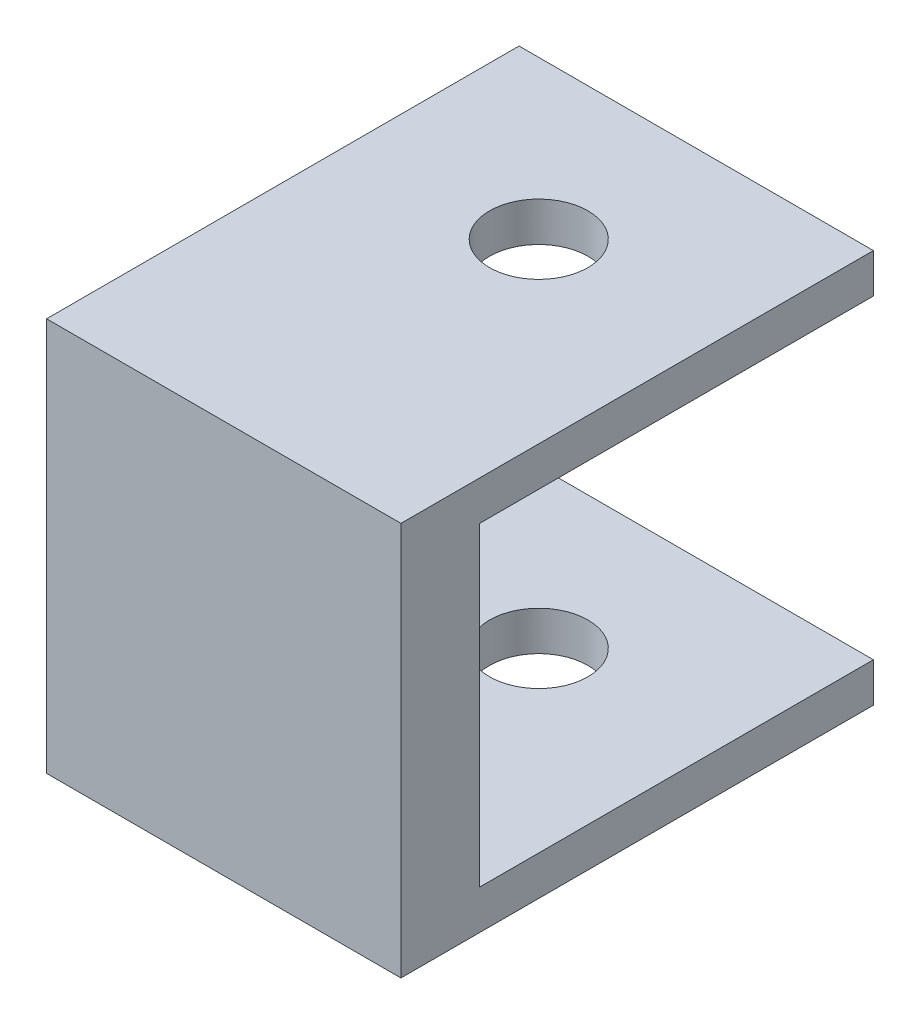
ISO-10303-21;
HEADER;
FILE_DESCRIPTION(('STEP AP214'),'2;1');
FILE_NAME('part.step','',(''),(''),'','','');
FILE_SCHEMA(('AUTOMOTIVE_DESIGN { 1 0 10303 214 1 1 1 1 }'));
ENDSEC;
DATA;
#1=APPLICATION_CONTEXT('core data for automotive mechanical design processes');
#2=APPLICATION_PROTOCOL_DEFINITION('international standard','automotive_design',2000,#1);
#3=PRODUCT_CONTEXT('',#1,'mechanical');
#4=PRODUCT('Part','Part','',(#3));
#5=PRODUCT_RELATED_PRODUCT_CATEGORY('part','',(#4));
#6=PRODUCT_DEFINITION_FORMATION('','',#4);
#7=PRODUCT_DEFINITION_CONTEXT('part definition',#1,'design');
#8=PRODUCT_DEFINITION('design','',#6,#7);
#9=PRODUCT_DEFINITION_SHAPE('','',#8);
#10=(LENGTH_UNIT() NAMED_UNIT(*) SI_UNIT(.MILLI.,.METRE.));
#11=(NAMED_UNIT(*) PLANE_ANGLE_UNIT() SI_UNIT($,.RADIAN.));
#12=(NAMED_UNIT(*) SI_UNIT($,.STERADIAN.) SOLID_ANGLE_UNIT());
#13=UNCERTAINTY_MEASURE_WITH_UNIT(LENGTH_MEASURE(1.E-05),#10,'distance_accuracy_value','');
#14=(GEOMETRIC_REPRESENTATION_CONTEXT(3) GLOBAL_UNCERTAINTY_ASSIGNED_CONTEXT((#13)) GLOBAL_UNIT_ASSIGNED_CONTEXT((#10,
#11,#12)) REPRESENTATION_CONTEXT('',''));
#15=CARTESIAN_POINT('',(0.,0.,0.));
#16=DIRECTION('',(0.,0.,1.));
#17=DIRECTION('',(1.,0.,0.));
#18=AXIS2_PLACEMENT_3D('',#15,#16,#17);
#19=CARTESIAN_POINT('',(18.,20.,-24.));
#20=DIRECTION('',(0.,-1.,0.));
#21=DIRECTION('',(0.,0.,-1.));
#22=AXIS2_PLACEMENT_3D('',#19,#20,#21);
#23=PLANE('',#22);
#24=CARTESIAN_POINT('',(9.,20.,-16.));
#25=DIRECTION('',(0.,-1.,0.));
#26=DIRECTION('',(0.,0.,-1.));
#27=AXIS2_PLACEMENT_3D('',#24,#25,#26);
#28=CIRCLE('',#27,2.5);
#29=CARTESIAN_POINT('',(9.,20.,-18.5));
#30=VERTEX_POINT('',#29);
#31=EDGE_CURVE('E138',#30,#30,#28,.F.);
#32=ORIENTED_EDGE('',*,*,#31,.F.);
#33=EDGE_LOOP('',(#32));
#34=FACE_BOUND('',#33,.T.);
#35=DIRECTION('',(0.,0.,1.));
#36=VECTOR('',#35,1.);
#37=CARTESIAN_POINT('',(0.,20.,-24.));
#38=LINE('',#37,#36);
#39=CARTESIAN_POINT('',(0.,20.,-24.));
#40=VERTEX_POINT('',#39);
#41=CARTESIAN_POINT('',(0.,20.,0.));
#42=VERTEX_POINT('',#41);
#43=EDGE_CURVE('E134',#40,#42,#38,.T.);
#44=ORIENTED_EDGE('',*,*,#43,.T.);
#45=DIRECTION('',(-1.,0.,0.));
#46=VECTOR('',#45,1.);
#47=CARTESIAN_POINT('',(18.,20.,0.));
#48=LINE('',#47,#46);
#49=CARTESIAN_POINT('',(18.,20.,0.));
#50=VERTEX_POINT('',#49);
#51=EDGE_CURVE('E11',#50,#42,#48,.T.);
#52=ORIENTED_EDGE('',*,*,#51,.F.);
#53=DIRECTION('',(0.,0.,1.));
#54=VECTOR('',#53,1.);
#55=CARTESIAN_POINT('',(18.,20.,-24.));
#56=LINE('',#55,#54);
#57=CARTESIAN_POINT('',(18.,20.,-24.));
#58=VERTEX_POINT('',#57);
#59=EDGE_CURVE('E149',#58,#50,#56,.T.);
#60=ORIENTED_EDGE('',*,*,#59,.F.);
#61=DIRECTION('',(-1.,0.,0.));
#62=VECTOR('',#61,1.);
#63=CARTESIAN_POINT('',(18.,20.,-24.));
#64=LINE('',#63,#62);
#65=EDGE_CURVE('E130',#58,#40,#64,.T.);
#66=ORIENTED_EDGE('',*,*,#65,.T.);
#67=EDGE_LOOP('',(#44,#52,#60,#66));
#68=FACE_BOUND('',#67,.T.);
#69=ADVANCED_FACE('F37',(#34,#68),#23,.F.);
#70=CARTESIAN_POINT('',(18.,20.,0.));
#71=DIRECTION('',(0.,0.,-1.));
#72=DIRECTION('',(-1.,0.,0.));
#73=AXIS2_PLACEMENT_3D('',#70,#71,#72);
#74=PLANE('',#73);
#75=DIRECTION('',(0.,-1.,0.));
#76=VECTOR('',#75,1.);
#77=CARTESIAN_POINT('',(0.,20.,0.));
#78=LINE('',#77,#76);
#79=CARTESIAN_POINT('',(0.,0.,0.));
#80=VERTEX_POINT('',#79);
#81=EDGE_CURVE('E137',#42,#80,#78,.T.);
#82=ORIENTED_EDGE('',*,*,#81,.T.);
#83=DIRECTION('',(-1.,0.,0.));
#84=VECTOR('',#83,1.);
#85=CARTESIAN_POINT('',(18.,0.,0.));
#86=LINE('',#85,#84);
#87=CARTESIAN_POINT('',(18.,0.,0.));
#88=VERTEX_POINT('',#87);
#89=EDGE_CURVE('E46',#88,#80,#86,.T.);
#90=ORIENTED_EDGE('',*,*,#89,.F.);
#91=DIRECTION('',(0.,-1.,0.));
#92=VECTOR('',#91,1.);
#93=CARTESIAN_POINT('',(18.,20.,0.));
#94=LINE('',#93,#92);
#95=EDGE_CURVE('E97',#50,#88,#94,.T.);
#96=ORIENTED_EDGE('',*,*,#95,.F.);
#97=ORIENTED_EDGE('',*,*,#51,.T.);
#98=EDGE_LOOP('',(#82,#90,#96,#97));
#99=FACE_BOUND('',#98,.T.);
#100=ADVANCED_FACE('F208',(#99),#74,.F.);
#101=CARTESIAN_POINT('',(18.,0.,0.));
#102=DIRECTION('',(0.,1.,0.));
#103=DIRECTION('',(0.,0.,1.));
#104=AXIS2_PLACEMENT_3D('',#101,#102,#103);
#105=PLANE('',#104);
#106=CARTESIAN_POINT('',(9.,0.,-16.));
#107=DIRECTION('',(0.,1.,0.));
#108=DIRECTION('',(0.,0.,1.));
#109=AXIS2_PLACEMENT_3D('',#106,#107,#108);
#110=CIRCLE('',#109,2.5);
#111=CARTESIAN_POINT('',(9.,0.,-13.5));
#112=VERTEX_POINT('',#111);
#113=EDGE_CURVE('E185',#112,#112,#110,.F.);
#114=ORIENTED_EDGE('',*,*,#113,.F.);
#115=EDGE_LOOP('',(#114));
#116=FACE_BOUND('',#115,.T.);
#117=DIRECTION('',(0.,0.,-1.));
#118=VECTOR('',#117,1.);
#119=CARTESIAN_POINT('',(0.,0.,0.));
#120=LINE('',#119,#118);
#121=CARTESIAN_POINT('',(0.,0.,-24.));
#122=VERTEX_POINT('',#121);
#123=EDGE_CURVE('E140',#80,#122,#120,.T.);
#124=ORIENTED_EDGE('',*,*,#123,.T.);
#125=DIRECTION('',(-1.,0.,0.));
#126=VECTOR('',#125,1.);
#127=CARTESIAN_POINT('',(18.,0.,-24.));
#128=LINE('',#127,#126);
#129=CARTESIAN_POINT('',(18.,0.,-24.));
#130=VERTEX_POINT('',#129);
#131=EDGE_CURVE('E156',#130,#122,#128,.T.);
#132=ORIENTED_EDGE('',*,*,#131,.F.);
#133=DIRECTION('',(0.,0.,-1.));
#134=VECTOR('',#133,1.);
#135=CARTESIAN_POINT('',(18.,0.,0.));
#136=LINE('',#135,#134);
#137=EDGE_CURVE('E165',#88,#130,#136,.T.);
#138=ORIENTED_EDGE('',*,*,#137,.F.);
#139=ORIENTED_EDGE('',*,*,#89,.T.);
#140=EDGE_LOOP('',(#124,#132,#138,#139));
#141=FACE_BOUND('',#140,.T.);
#142=ADVANCED_FACE('F163',(#116,#141),#105,.F.);
#143=CARTESIAN_POINT('',(18.,0.,-24.));
#144=DIRECTION('',(0.,0.,1.));
#145=DIRECTION('',(1.,0.,0.));
#146=AXIS2_PLACEMENT_3D('',#143,#144,#145);
#147=PLANE('',#146);
#148=DIRECTION('',(0.,1.,0.));
#149=VECTOR('',#148,1.);
#150=CARTESIAN_POINT('',(0.,0.,-24.));
#151=LINE('',#150,#149);
#152=CARTESIAN_POINT('',(0.,2.00000000000001,-24.));
#153=VERTEX_POINT('',#152);
#154=EDGE_CURVE('E142',#122,#153,#151,.T.);
#155=ORIENTED_EDGE('',*,*,#154,.T.);
#156=DIRECTION('',(-1.,0.,0.));
#157=VECTOR('',#156,1.);
#158=CARTESIAN_POINT('',(18.,2.00000000000001,-24.));
#159=LINE('',#158,#157);
#160=CARTESIAN_POINT('',(18.,2.00000000000001,-24.));
#161=VERTEX_POINT('',#160);
#162=EDGE_CURVE('E153',#161,#153,#159,.T.);
#163=ORIENTED_EDGE('',*,*,#162,.F.);
#164=DIRECTION('',(0.,1.,0.));
#165=VECTOR('',#164,1.);
#166=CARTESIAN_POINT('',(18.,0.,-24.));
#167=LINE('',#166,#165);
#168=EDGE_CURVE('E177',#130,#161,#167,.T.);
#169=ORIENTED_EDGE('',*,*,#168,.F.);
#170=ORIENTED_EDGE('',*,*,#131,.T.);
#171=EDGE_LOOP('',(#155,#163,#169,#170));
#172=FACE_BOUND('',#171,.T.);
#173=ADVANCED_FACE('F173',(#172),#147,.F.);
#174=CARTESIAN_POINT('',(18.,2.00000000000001,-24.));
#175=DIRECTION('',(0.,-1.,0.));
#176=DIRECTION('',(0.,0.,-1.));
#177=AXIS2_PLACEMENT_3D('',#174,#175,#176);
#178=PLANE('',#177);
#179=CARTESIAN_POINT('',(9.,2.,-16.));
#180=DIRECTION('',(0.,-1.,0.));
#181=DIRECTION('',(0.,0.,-1.));
#182=AXIS2_PLACEMENT_3D('',#179,#180,#181);
#183=CIRCLE('',#182,2.5);
#184=CARTESIAN_POINT('',(9.,2.,-18.5));
#185=VERTEX_POINT('',#184);
#186=EDGE_CURVE('E188',#185,#185,#183,.F.);
#187=ORIENTED_EDGE('',*,*,#186,.F.);
#188=EDGE_LOOP('',(#187));
#189=FACE_BOUND('',#188,.T.);
#190=DIRECTION('',(0.,0.,1.));
#191=VECTOR('',#190,1.);
#192=CARTESIAN_POINT('',(0.,2.00000000000001,-24.));
#193=LINE('',#192,#191);
#194=CARTESIAN_POINT('',(0.,2.,-4.));
#195=VERTEX_POINT('',#194);
#196=EDGE_CURVE('E144',#153,#195,#193,.T.);
#197=ORIENTED_EDGE('',*,*,#196,.T.);
#198=DIRECTION('',(-1.,0.,0.));
#199=VECTOR('',#198,1.);
#200=CARTESIAN_POINT('',(18.,2.,-4.));
#201=LINE('',#200,#199);
#202=CARTESIAN_POINT('',(18.,2.,-4.));
#203=VERTEX_POINT('',#202);
#204=EDGE_CURVE('E125',#203,#195,#201,.T.);
#205=ORIENTED_EDGE('',*,*,#204,.F.);
#206=DIRECTION('',(0.,0.,1.));
#207=VECTOR('',#206,1.);
#208=CARTESIAN_POINT('',(18.,2.00000000000001,-24.));
#209=LINE('',#208,#207);
#210=EDGE_CURVE('E116',#161,#203,#209,.T.);
#211=ORIENTED_EDGE('',*,*,#210,.F.);
#212=ORIENTED_EDGE('',*,*,#162,.T.);
#213=EDGE_LOOP('',(#197,#205,#211,#212));
#214=FACE_BOUND('',#213,.T.);
#215=ADVANCED_FACE('F176',(#189,#214),#178,.F.);
#216=CARTESIAN_POINT('',(18.,2.,-4.));
#217=DIRECTION('',(0.,0.,1.));
#218=DIRECTION('',(0.,-1.,0.));
#219=AXIS2_PLACEMENT_3D('',#216,#217,#218);
#220=PLANE('',#219);
#221=DIRECTION('',(0.,1.,0.));
#222=VECTOR('',#221,1.);
#223=CARTESIAN_POINT('',(0.,2.,-4.));
#224=LINE('',#223,#222);
#225=CARTESIAN_POINT('',(0.,18.,-4.));
#226=VERTEX_POINT('',#225);
#227=EDGE_CURVE('E124',#195,#226,#224,.T.);
#228=ORIENTED_EDGE('',*,*,#227,.T.);
#229=DIRECTION('',(-1.,0.,0.));
#230=VECTOR('',#229,1.);
#231=CARTESIAN_POINT('',(18.,18.,-4.));
#232=LINE('',#231,#230);
#233=CARTESIAN_POINT('',(18.,18.,-4.));
#234=VERTEX_POINT('',#233);
#235=EDGE_CURVE('E121',#234,#226,#232,.T.);
#236=ORIENTED_EDGE('',*,*,#235,.F.);
#237=DIRECTION('',(0.,1.,0.));
#238=VECTOR('',#237,1.);
#239=CARTESIAN_POINT('',(18.,2.,-4.));
#240=LINE('',#239,#238);
#241=EDGE_CURVE('E110',#203,#234,#240,.T.);
#242=ORIENTED_EDGE('',*,*,#241,.F.);
#243=ORIENTED_EDGE('',*,*,#204,.T.);
#244=EDGE_LOOP('',(#228,#236,#242,#243));
#245=FACE_BOUND('',#244,.T.);
#246=ADVANCED_FACE('F122',(#245),#220,.F.);
#247=CARTESIAN_POINT('',(18.,18.,-4.));
#248=DIRECTION('',(0.,1.,0.));
#249=DIRECTION('',(0.,0.,1.));
#250=AXIS2_PLACEMENT_3D('',#247,#248,#249);
#251=PLANE('',#250);
#252=CARTESIAN_POINT('',(9.,18.,-16.));
#253=DIRECTION('',(0.,1.,0.));
#254=DIRECTION('',(0.,0.,1.));
#255=AXIS2_PLACEMENT_3D('',#252,#253,#254);
#256=CIRCLE('',#255,2.5);
#257=CARTESIAN_POINT('',(9.,18.,-13.5));
#258=VERTEX_POINT('',#257);
#259=EDGE_CURVE('E40',#258,#258,#256,.F.);
#260=ORIENTED_EDGE('',*,*,#259,.F.);
#261=EDGE_LOOP('',(#260));
#262=FACE_BOUND('',#261,.T.);
#263=DIRECTION('',(0.,0.,-1.));
#264=VECTOR('',#263,1.);
#265=CARTESIAN_POINT('',(0.,18.,-4.));
#266=LINE('',#265,#264);
#267=CARTESIAN_POINT('',(0.,18.,-24.));
#268=VERTEX_POINT('',#267);
#269=EDGE_CURVE('E83',#226,#268,#266,.T.);
#270=ORIENTED_EDGE('',*,*,#269,.T.);
#271=DIRECTION('',(-1.,0.,0.));
#272=VECTOR('',#271,1.);
#273=CARTESIAN_POINT('',(18.,18.,-24.));
#274=LINE('',#273,#272);
#275=CARTESIAN_POINT('',(18.,18.,-24.));
#276=VERTEX_POINT('',#275);
#277=EDGE_CURVE('E126',#276,#268,#274,.T.);
#278=ORIENTED_EDGE('',*,*,#277,.F.);
#279=DIRECTION('',(0.,0.,-1.));
#280=VECTOR('',#279,1.);
#281=CARTESIAN_POINT('',(18.,18.,-4.));
#282=LINE('',#281,#280);
#283=EDGE_CURVE('E114',#234,#276,#282,.T.);
#284=ORIENTED_EDGE('',*,*,#283,.F.);
#285=ORIENTED_EDGE('',*,*,#235,.T.);
#286=EDGE_LOOP('',(#270,#278,#284,#285));
#287=FACE_BOUND('',#286,.T.);
#288=ADVANCED_FACE('F128',(#262,#287),#251,.F.);
#289=CARTESIAN_POINT('',(18.,18.,-24.));
#290=DIRECTION('',(0.,0.,1.));
#291=DIRECTION('',(0.,-1.,0.));
#292=AXIS2_PLACEMENT_3D('',#289,#290,#291);
#293=PLANE('',#292);
#294=DIRECTION('',(0.,1.,0.));
#295=VECTOR('',#294,1.);
#296=CARTESIAN_POINT('',(0.,18.,-24.));
#297=LINE('',#296,#295);
#298=EDGE_CURVE('E89',#268,#40,#297,.T.);
#299=ORIENTED_EDGE('',*,*,#298,.T.);
#300=ORIENTED_EDGE('',*,*,#65,.F.);
#301=DIRECTION('',(0.,1.,0.));
#302=VECTOR('',#301,1.);
#303=CARTESIAN_POINT('',(18.,18.,-24.));
#304=LINE('',#303,#302);
#305=EDGE_CURVE('E54',#276,#58,#304,.T.);
#306=ORIENTED_EDGE('',*,*,#305,.F.);
#307=ORIENTED_EDGE('',*,*,#277,.T.);
#308=EDGE_LOOP('',(#299,#300,#306,#307));
#309=FACE_BOUND('',#308,.T.);
#310=ADVANCED_FACE('F199',(#309),#293,.F.);
#311=CARTESIAN_POINT('',(18.,0.,0.));
#312=DIRECTION('',(1.,0.,0.));
#313=DIRECTION('',(0.,0.,-1.));
#314=AXIS2_PLACEMENT_3D('',#311,#312,#313);
#315=PLANE('',#314);
#316=ORIENTED_EDGE('',*,*,#59,.T.);
#317=ORIENTED_EDGE('',*,*,#95,.T.);
#318=ORIENTED_EDGE('',*,*,#137,.T.);
#319=ORIENTED_EDGE('',*,*,#168,.T.);
#320=ORIENTED_EDGE('',*,*,#210,.T.);
#321=ORIENTED_EDGE('',*,*,#241,.T.);
#322=ORIENTED_EDGE('',*,*,#283,.T.);
#323=ORIENTED_EDGE('',*,*,#305,.T.);
#324=EDGE_LOOP('',(#316,#317,#318,#319,#320,#321,#322,#323));
#325=FACE_BOUND('',#324,.T.);
#326=ADVANCED_FACE('F112',(#325),#315,.T.);
#327=CARTESIAN_POINT('',(0.,0.,0.));
#328=DIRECTION('',(1.,0.,0.));
#329=DIRECTION('',(0.,0.,-1.));
#330=AXIS2_PLACEMENT_3D('',#327,#328,#329);
#331=PLANE('',#330);
#332=ORIENTED_EDGE('',*,*,#43,.F.);
#333=ORIENTED_EDGE('',*,*,#298,.F.);
#334=ORIENTED_EDGE('',*,*,#269,.F.);
#335=ORIENTED_EDGE('',*,*,#227,.F.);
#336=ORIENTED_EDGE('',*,*,#196,.F.);
#337=ORIENTED_EDGE('',*,*,#154,.F.);
#338=ORIENTED_EDGE('',*,*,#123,.F.);
#339=ORIENTED_EDGE('',*,*,#81,.F.);
#340=EDGE_LOOP('',(#332,#333,#334,#335,#336,#337,#338,#339));
#341=FACE_BOUND('',#340,.T.);
#342=ADVANCED_FACE('F169',(#341),#331,.F.);
#343=CARTESIAN_POINT('',(9.,39.,-16.));
#344=DIRECTION('',(0.,-1.,0.));
#345=DIRECTION('',(0.,0.,-1.));
#346=AXIS2_PLACEMENT_3D('',#343,#344,#345);
#347=CYLINDRICAL_SURFACE('',#346,2.5);
#348=ORIENTED_EDGE('',*,*,#259,.T.);
#349=EDGE_LOOP('',(#348));
#350=FACE_BOUND('',#349,.T.);
#351=ORIENTED_EDGE('',*,*,#31,.T.);
#352=EDGE_LOOP('',(#351));
#353=FACE_BOUND('',#352,.T.);
#354=ADVANCED_FACE('F195',(#350,#353),#347,.F.);
#355=ORIENTED_EDGE('',*,*,#186,.T.);
#356=EDGE_LOOP('',(#355));
#357=FACE_BOUND('',#356,.T.);
#358=ORIENTED_EDGE('',*,*,#113,.T.);
#359=EDGE_LOOP('',(#358));
#360=FACE_BOUND('',#359,.T.);
#361=ADVANCED_FACE('F218',(#357,#360),#347,.F.);
#362=CLOSED_SHELL('',(#69,#100,#142,#173,#215,#246,#288,#310,#326,#342,#354,#361));
#363=MANIFOLD_SOLID_BREP('B2',#362);
#364=ADVANCED_BREP_SHAPE_REPRESENTATION('',(#18,#363),#14);
#365=SHAPE_DEFINITION_REPRESENTATION(#9,#364);
ENDSEC;
END-ISO-10303-21;
